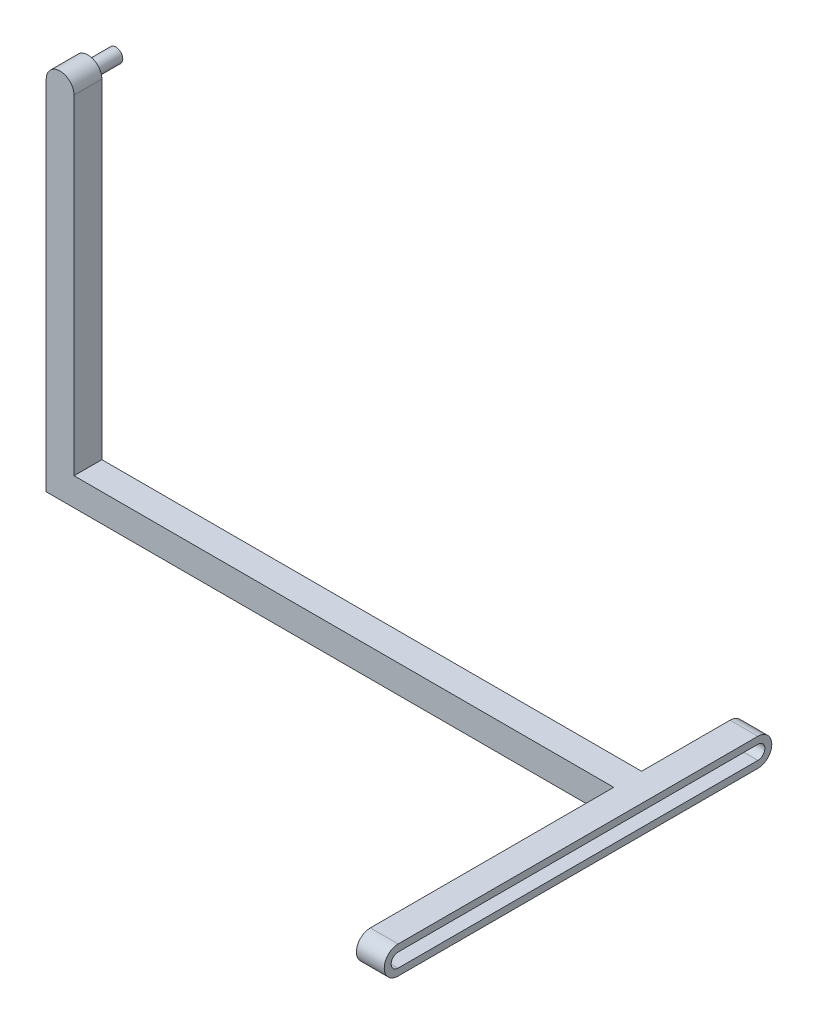
ISO-10303-21;
HEADER;
FILE_DESCRIPTION(('STEP AP214'),'2;1');
FILE_NAME('part.step','',(''),(''),'','','');
FILE_SCHEMA(('AUTOMOTIVE_DESIGN { 1 0 10303 214 1 1 1 1 }'));
ENDSEC;
DATA;
#1=APPLICATION_CONTEXT('core data for automotive mechanical design processes');
#2=APPLICATION_PROTOCOL_DEFINITION('international standard','automotive_design',2000,#1);
#3=PRODUCT_CONTEXT('',#1,'mechanical');
#4=PRODUCT('Part','Part','',(#3));
#5=PRODUCT_RELATED_PRODUCT_CATEGORY('part','',(#4));
#6=PRODUCT_DEFINITION_FORMATION('','',#4);
#7=PRODUCT_DEFINITION_CONTEXT('part definition',#1,'design');
#8=PRODUCT_DEFINITION('design','',#6,#7);
#9=PRODUCT_DEFINITION_SHAPE('','',#8);
#10=(LENGTH_UNIT() NAMED_UNIT(*) SI_UNIT(.MILLI.,.METRE.));
#11=(NAMED_UNIT(*) PLANE_ANGLE_UNIT() SI_UNIT($,.RADIAN.));
#12=(NAMED_UNIT(*) SI_UNIT($,.STERADIAN.) SOLID_ANGLE_UNIT());
#13=UNCERTAINTY_MEASURE_WITH_UNIT(LENGTH_MEASURE(1.E-05),#10,'distance_accuracy_value','');
#14=(GEOMETRIC_REPRESENTATION_CONTEXT(3) GLOBAL_UNCERTAINTY_ASSIGNED_CONTEXT((#13)) GLOBAL_UNIT_ASSIGNED_CONTEXT((#10,
#11,#12)) REPRESENTATION_CONTEXT('',''));
#15=CARTESIAN_POINT('',(0.,0.,0.));
#16=DIRECTION('',(0.,0.,1.));
#17=DIRECTION('',(1.,0.,0.));
#18=AXIS2_PLACEMENT_3D('',#15,#16,#17);
#19=CARTESIAN_POINT('',(0.,0.,-199.));
#20=DIRECTION('',(0.,0.,1.));
#21=DIRECTION('',(1.,0.,0.));
#22=AXIS2_PLACEMENT_3D('',#19,#20,#21);
#23=PLANE('',#22);
#24=DIRECTION('',(0.,1.,0.));
#25=VECTOR('',#24,1.);
#26=CARTESIAN_POINT('',(-20.,0.,-199.));
#27=LINE('',#26,#25);
#28=CARTESIAN_POINT('',(-20.,-193.443240014958,-199.));
#29=VERTEX_POINT('',#28);
#30=CARTESIAN_POINT('',(-20.,-191.443240014958,-199.));
#31=VERTEX_POINT('',#30);
#32=EDGE_CURVE('E161',#29,#31,#27,.T.);
#33=ORIENTED_EDGE('',*,*,#32,.T.);
#34=DIRECTION('',(0.,1.,0.));
#35=VECTOR('',#34,1.);
#36=CARTESIAN_POINT('',(-20.,0.,-199.));
#37=LINE('',#36,#35);
#38=CARTESIAN_POINT('',(-20.,-187.443240014958,-199.));
#39=VERTEX_POINT('',#38);
#40=EDGE_CURVE('E152',#31,#39,#37,.T.);
#41=ORIENTED_EDGE('',*,*,#40,.T.);
#42=CARTESIAN_POINT('',(-20.,-185.443240014958,-199.));
#43=VERTEX_POINT('',#42);
#44=EDGE_CURVE('E52',#39,#43,#27,.T.);
#45=ORIENTED_EDGE('',*,*,#44,.T.);
#46=DIRECTION('',(1.,0.,0.));
#47=VECTOR('',#46,1.);
#48=CARTESIAN_POINT('',(0.,-185.443240014958,-199.));
#49=LINE('',#48,#47);
#50=CARTESIAN_POINT('',(-175.088311754569,-185.443240014958,-199.));
#51=VERTEX_POINT('',#50);
#52=EDGE_CURVE('E249',#51,#43,#49,.T.);
#53=ORIENTED_EDGE('',*,*,#52,.F.);
#54=DIRECTION('',(0.,-1.,0.));
#55=VECTOR('',#54,1.);
#56=CARTESIAN_POINT('',(-175.088311754569,0.,-199.));
#57=LINE('',#56,#55);
#58=CARTESIAN_POINT('',(-175.088311754569,-90.7316967124509,-199.));
#59=VERTEX_POINT('',#58);
#60=EDGE_CURVE('E239',#59,#51,#57,.T.);
#61=ORIENTED_EDGE('',*,*,#60,.F.);
#62=CARTESIAN_POINT('',(-179.088311754569,-90.7316967124509,-199.));
#63=DIRECTION('',(0.,0.,1.));
#64=DIRECTION('',(1.,0.,0.));
#65=AXIS2_PLACEMENT_3D('',#62,#63,#64);
#66=CIRCLE('',#65,4.);
#67=CARTESIAN_POINT('',(-183.088311754569,-90.7316967124509,-199.));
#68=VERTEX_POINT('',#67);
#69=EDGE_CURVE('E242',#68,#59,#66,.F.);
#70=ORIENTED_EDGE('',*,*,#69,.F.);
#71=DIRECTION('',(0.,-1.,0.));
#72=VECTOR('',#71,1.);
#73=CARTESIAN_POINT('',(-183.088311754569,0.,-199.));
#74=LINE('',#73,#72);
#75=CARTESIAN_POINT('',(-183.088311754569,-193.443240014958,-199.));
#76=VERTEX_POINT('',#75);
#77=EDGE_CURVE('E246',#68,#76,#74,.T.);
#78=ORIENTED_EDGE('',*,*,#77,.T.);
#79=DIRECTION('',(1.,0.,0.));
#80=VECTOR('',#79,1.);
#81=CARTESIAN_POINT('',(0.,-193.443240014958,-199.));
#82=LINE('',#81,#80);
#83=EDGE_CURVE('E59',#76,#29,#82,.T.);
#84=ORIENTED_EDGE('',*,*,#83,.T.);
#85=EDGE_LOOP('',(#33,#41,#45,#53,#61,#70,#78,#84));
#86=FACE_BOUND('',#85,.T.);
#87=ADVANCED_FACE('F37',(#86),#23,.T.);
#88=CARTESIAN_POINT('',(0.,0.,-207.));
#89=DIRECTION('',(0.,0.,1.));
#90=DIRECTION('',(1.,0.,0.));
#91=AXIS2_PLACEMENT_3D('',#88,#89,#90);
#92=PLANE('',#91);
#93=CARTESIAN_POINT('',(-179.088311754569,-90.7316967124509,-207.));
#94=DIRECTION('',(0.,0.,1.));
#95=DIRECTION('',(1.,0.,0.));
#96=AXIS2_PLACEMENT_3D('',#93,#94,#95);
#97=CIRCLE('',#96,2.);
#98=CARTESIAN_POINT('',(-177.088311754569,-90.7316967124509,-207.));
#99=VERTEX_POINT('',#98);
#100=EDGE_CURVE('E275',#99,#99,#97,.F.);
#101=ORIENTED_EDGE('',*,*,#100,.F.);
#102=EDGE_LOOP('',(#101));
#103=FACE_BOUND('',#102,.T.);
#104=DIRECTION('',(0.,1.,0.));
#105=VECTOR('',#104,1.);
#106=CARTESIAN_POINT('',(-20.,0.,-207.));
#107=LINE('',#106,#105);
#108=CARTESIAN_POINT('',(-20.,-191.443240014958,-207.));
#109=VERTEX_POINT('',#108);
#110=CARTESIAN_POINT('',(-20.,-187.443240014958,-207.));
#111=VERTEX_POINT('',#110);
#112=EDGE_CURVE('E155',#109,#111,#107,.T.);
#113=ORIENTED_EDGE('',*,*,#112,.F.);
#114=DIRECTION('',(0.,1.,0.));
#115=VECTOR('',#114,1.);
#116=CARTESIAN_POINT('',(-20.,0.,-207.));
#117=LINE('',#116,#115);
#118=CARTESIAN_POINT('',(-20.,-193.443240014958,-207.));
#119=VERTEX_POINT('',#118);
#120=EDGE_CURVE('E41',#119,#109,#117,.T.);
#121=ORIENTED_EDGE('',*,*,#120,.F.);
#122=DIRECTION('',(1.,0.,0.));
#123=VECTOR('',#122,1.);
#124=CARTESIAN_POINT('',(0.,-193.443240014958,-207.));
#125=LINE('',#124,#123);
#126=CARTESIAN_POINT('',(-183.088311754569,-193.443240014958,-207.));
#127=VERTEX_POINT('',#126);
#128=EDGE_CURVE('E259',#127,#119,#125,.T.);
#129=ORIENTED_EDGE('',*,*,#128,.F.);
#130=DIRECTION('',(0.,-1.,0.));
#131=VECTOR('',#130,1.);
#132=CARTESIAN_POINT('',(-183.088311754569,0.,-207.));
#133=LINE('',#132,#131);
#134=CARTESIAN_POINT('',(-183.088311754569,-90.7316967124509,-207.));
#135=VERTEX_POINT('',#134);
#136=EDGE_CURVE('E257',#135,#127,#133,.T.);
#137=ORIENTED_EDGE('',*,*,#136,.F.);
#138=CARTESIAN_POINT('',(-179.088311754569,-90.7316967124509,-207.));
#139=DIRECTION('',(0.,0.,1.));
#140=DIRECTION('',(1.,0.,0.));
#141=AXIS2_PLACEMENT_3D('',#138,#139,#140);
#142=CIRCLE('',#141,4.);
#143=CARTESIAN_POINT('',(-175.088311754569,-90.7316967124509,-207.));
#144=VERTEX_POINT('',#143);
#145=EDGE_CURVE('E254',#135,#144,#142,.F.);
#146=ORIENTED_EDGE('',*,*,#145,.T.);
#147=DIRECTION('',(0.,-1.,0.));
#148=VECTOR('',#147,1.);
#149=CARTESIAN_POINT('',(-175.088311754569,0.,-207.));
#150=LINE('',#149,#148);
#151=CARTESIAN_POINT('',(-175.088311754569,-185.443240014958,-207.));
#152=VERTEX_POINT('',#151);
#153=EDGE_CURVE('E238',#144,#152,#150,.T.);
#154=ORIENTED_EDGE('',*,*,#153,.T.);
#155=DIRECTION('',(1.,0.,0.));
#156=VECTOR('',#155,1.);
#157=CARTESIAN_POINT('',(0.,-185.443240014958,-207.));
#158=LINE('',#157,#156);
#159=CARTESIAN_POINT('',(-20.,-185.443240014958,-207.));
#160=VERTEX_POINT('',#159);
#161=EDGE_CURVE('E243',#152,#160,#158,.T.);
#162=ORIENTED_EDGE('',*,*,#161,.T.);
#163=EDGE_CURVE('E11',#111,#160,#117,.T.);
#164=ORIENTED_EDGE('',*,*,#163,.F.);
#165=EDGE_LOOP('',(#113,#121,#129,#137,#146,#154,#162,#164));
#166=FACE_BOUND('',#165,.T.);
#167=ADVANCED_FACE('F288',(#103,#166),#92,.F.);
#168=CARTESIAN_POINT('',(-12.,0.,-199.));
#169=DIRECTION('',(1.,0.,0.));
#170=DIRECTION('',(0.,0.,-1.));
#171=AXIS2_PLACEMENT_3D('',#168,#169,#170);
#172=PLANE('',#171);
#173=DIRECTION('',(0.,0.,-1.));
#174=VECTOR('',#173,1.);
#175=CARTESIAN_POINT('',(-12.,-193.443240014958,-199.));
#176=LINE('',#175,#174);
#177=CARTESIAN_POINT('',(-12.,-193.443240014958,-129.046106882113));
#178=VERTEX_POINT('',#177);
#179=CARTESIAN_POINT('',(-12.,-193.443240014958,-232.412295168564));
#180=VERTEX_POINT('',#179);
#181=EDGE_CURVE('E267',#178,#180,#176,.T.);
#182=ORIENTED_EDGE('',*,*,#181,.T.);
#183=CARTESIAN_POINT('',(-12.,-189.443240014958,-232.412295168564));
#184=DIRECTION('',(-1.,0.,0.));
#185=DIRECTION('',(0.,0.,1.));
#186=AXIS2_PLACEMENT_3D('',#183,#184,#185);
#187=CIRCLE('',#186,4.);
#188=CARTESIAN_POINT('',(-12.,-185.443240014958,-232.412295168564));
#189=VERTEX_POINT('',#188);
#190=EDGE_CURVE('E213',#189,#180,#187,.T.);
#191=ORIENTED_EDGE('',*,*,#190,.F.);
#192=DIRECTION('',(0.,0.,-1.));
#193=VECTOR('',#192,1.);
#194=CARTESIAN_POINT('',(-12.,-185.443240014958,-199.));
#195=LINE('',#194,#193);
#196=CARTESIAN_POINT('',(-12.,-185.443240014958,-129.046106882113));
#197=VERTEX_POINT('',#196);
#198=EDGE_CURVE('E265',#197,#189,#195,.T.);
#199=ORIENTED_EDGE('',*,*,#198,.F.);
#200=CARTESIAN_POINT('',(-12.,-189.443240014958,-129.046106882113));
#201=DIRECTION('',(-1.,0.,0.));
#202=DIRECTION('',(0.,0.,-1.));
#203=AXIS2_PLACEMENT_3D('',#200,#201,#202);
#204=CIRCLE('',#203,4.);
#205=EDGE_CURVE('E209',#178,#197,#204,.T.);
#206=ORIENTED_EDGE('',*,*,#205,.F.);
#207=EDGE_LOOP('',(#182,#191,#199,#206));
#208=FACE_BOUND('',#207,.T.);
#209=CARTESIAN_POINT('',(-12.,-189.443240014958,-129.046106882113));
#210=DIRECTION('',(-1.,0.,0.));
#211=DIRECTION('',(0.,0.,-1.));
#212=AXIS2_PLACEMENT_3D('',#209,#210,#211);
#213=CIRCLE('',#212,2.);
#214=CARTESIAN_POINT('',(-12.,-191.443240014958,-129.046106882113));
#215=VERTEX_POINT('',#214);
#216=CARTESIAN_POINT('',(-12.,-187.443240014958,-129.046106882113));
#217=VERTEX_POINT('',#216);
#218=EDGE_CURVE('E163',#215,#217,#213,.T.);
#219=ORIENTED_EDGE('',*,*,#218,.T.);
#220=DIRECTION('',(0.,0.,-1.));
#221=VECTOR('',#220,1.);
#222=CARTESIAN_POINT('',(-12.,-187.443240014958,-129.046106882113));
#223=LINE('',#222,#221);
#224=CARTESIAN_POINT('',(-12.,-187.443240014958,-232.412295168564));
#225=VERTEX_POINT('',#224);
#226=EDGE_CURVE('E194',#217,#225,#223,.T.);
#227=ORIENTED_EDGE('',*,*,#226,.T.);
#228=CARTESIAN_POINT('',(-12.,-189.443240014958,-232.412295168564));
#229=DIRECTION('',(-1.,0.,0.));
#230=DIRECTION('',(0.,0.,1.));
#231=AXIS2_PLACEMENT_3D('',#228,#229,#230);
#232=CIRCLE('',#231,2.);
#233=CARTESIAN_POINT('',(-12.,-191.443240014958,-232.412295168564));
#234=VERTEX_POINT('',#233);
#235=EDGE_CURVE('E196',#225,#234,#232,.T.);
#236=ORIENTED_EDGE('',*,*,#235,.T.);
#237=DIRECTION('',(0.,0.,1.));
#238=VECTOR('',#237,1.);
#239=CARTESIAN_POINT('',(-12.,-191.443240014958,-129.046106882113));
#240=LINE('',#239,#238);
#241=EDGE_CURVE('E199',#234,#215,#240,.T.);
#242=ORIENTED_EDGE('',*,*,#241,.T.);
#243=EDGE_LOOP('',(#219,#227,#236,#242));
#244=FACE_BOUND('',#243,.T.);
#245=ADVANCED_FACE('F318',(#208,#244),#172,.T.);
#246=CARTESIAN_POINT('',(-175.088311754569,0.,-199.));
#247=DIRECTION('',(1.,0.,0.));
#248=DIRECTION('',(0.,0.,-1.));
#249=AXIS2_PLACEMENT_3D('',#246,#247,#248);
#250=PLANE('',#249);
#251=ORIENTED_EDGE('',*,*,#153,.F.);
#252=DIRECTION('',(0.,0.,-1.));
#253=VECTOR('',#252,1.);
#254=CARTESIAN_POINT('',(-175.088311754569,-90.7316967124509,-199.));
#255=LINE('',#254,#253);
#256=EDGE_CURVE('E274',#59,#144,#255,.T.);
#257=ORIENTED_EDGE('',*,*,#256,.F.);
#258=ORIENTED_EDGE('',*,*,#60,.T.);
#259=DIRECTION('',(0.,0.,-1.));
#260=VECTOR('',#259,1.);
#261=CARTESIAN_POINT('',(-175.088311754569,-185.443240014958,-199.));
#262=LINE('',#261,#260);
#263=EDGE_CURVE('E251',#51,#152,#262,.T.);
#264=ORIENTED_EDGE('',*,*,#263,.T.);
#265=EDGE_LOOP('',(#251,#257,#258,#264));
#266=FACE_BOUND('',#265,.T.);
#267=ADVANCED_FACE('F39',(#266),#250,.T.);
#268=CARTESIAN_POINT('',(-179.088311754569,-90.7316967124509,-199.));
#269=DIRECTION('',(0.,0.,-1.));
#270=DIRECTION('',(-1.,0.,0.));
#271=AXIS2_PLACEMENT_3D('',#268,#269,#270);
#272=CYLINDRICAL_SURFACE('',#271,4.);
#273=ORIENTED_EDGE('',*,*,#145,.F.);
#274=DIRECTION('',(0.,0.,-1.));
#275=VECTOR('',#274,1.);
#276=CARTESIAN_POINT('',(-183.088311754569,-90.7316967124509,-199.));
#277=LINE('',#276,#275);
#278=EDGE_CURVE('E272',#68,#135,#277,.T.);
#279=ORIENTED_EDGE('',*,*,#278,.F.);
#280=ORIENTED_EDGE('',*,*,#69,.T.);
#281=ORIENTED_EDGE('',*,*,#256,.T.);
#282=EDGE_LOOP('',(#273,#279,#280,#281));
#283=FACE_BOUND('',#282,.T.);
#284=ADVANCED_FACE('F301',(#283),#272,.T.);
#285=CARTESIAN_POINT('',(-183.088311754569,0.,-199.));
#286=DIRECTION('',(1.,0.,0.));
#287=DIRECTION('',(0.,0.,-1.));
#288=AXIS2_PLACEMENT_3D('',#285,#286,#287);
#289=PLANE('',#288);
#290=ORIENTED_EDGE('',*,*,#136,.T.);
#291=DIRECTION('',(0.,0.,-1.));
#292=VECTOR('',#291,1.);
#293=CARTESIAN_POINT('',(-183.088311754569,-193.443240014958,-199.));
#294=LINE('',#293,#292);
#295=EDGE_CURVE('E269',#76,#127,#294,.T.);
#296=ORIENTED_EDGE('',*,*,#295,.F.);
#297=ORIENTED_EDGE('',*,*,#77,.F.);
#298=ORIENTED_EDGE('',*,*,#278,.T.);
#299=EDGE_LOOP('',(#290,#296,#297,#298));
#300=FACE_BOUND('',#299,.T.);
#301=ADVANCED_FACE('F297',(#300),#289,.F.);
#302=CARTESIAN_POINT('',(0.,-193.443240014958,-199.));
#303=DIRECTION('',(0.,1.,0.));
#304=DIRECTION('',(0.,0.,1.));
#305=AXIS2_PLACEMENT_3D('',#302,#303,#304);
#306=PLANE('',#305);
#307=ORIENTED_EDGE('',*,*,#181,.F.);
#308=DIRECTION('',(1.,0.,0.));
#309=VECTOR('',#308,1.);
#310=CARTESIAN_POINT('',(-20.,-193.443240014958,-129.046106882113));
#311=LINE('',#310,#309);
#312=CARTESIAN_POINT('',(-20.,-193.443240014958,-129.046106882113));
#313=VERTEX_POINT('',#312);
#314=EDGE_CURVE('E220',#313,#178,#311,.T.);
#315=ORIENTED_EDGE('',*,*,#314,.F.);
#316=DIRECTION('',(0.,0.,1.));
#317=VECTOR('',#316,1.);
#318=CARTESIAN_POINT('',(-20.,-193.443240014958,-129.046106882113));
#319=LINE('',#318,#317);
#320=EDGE_CURVE('E217',#29,#313,#319,.T.);
#321=ORIENTED_EDGE('',*,*,#320,.F.);
#322=ORIENTED_EDGE('',*,*,#83,.F.);
#323=ORIENTED_EDGE('',*,*,#295,.T.);
#324=ORIENTED_EDGE('',*,*,#128,.T.);
#325=CARTESIAN_POINT('',(-20.,-193.443240014958,-232.412295168564));
#326=VERTEX_POINT('',#325);
#327=EDGE_CURVE('E218',#326,#119,#319,.T.);
#328=ORIENTED_EDGE('',*,*,#327,.F.);
#329=DIRECTION('',(1.,0.,0.));
#330=VECTOR('',#329,1.);
#331=CARTESIAN_POINT('',(-20.,-193.443240014958,-232.412295168564));
#332=LINE('',#331,#330);
#333=EDGE_CURVE('E227',#326,#180,#332,.T.);
#334=ORIENTED_EDGE('',*,*,#333,.T.);
#335=EDGE_LOOP('',(#307,#315,#321,#322,#323,#324,#328,#334));
#336=FACE_BOUND('',#335,.T.);
#337=ADVANCED_FACE('F292',(#336),#306,.F.);
#338=CARTESIAN_POINT('',(0.,-185.443240014958,-199.));
#339=DIRECTION('',(0.,1.,0.));
#340=DIRECTION('',(0.,0.,1.));
#341=AXIS2_PLACEMENT_3D('',#338,#339,#340);
#342=PLANE('',#341);
#343=DIRECTION('',(0.,0.,-1.));
#344=VECTOR('',#343,1.);
#345=CARTESIAN_POINT('',(-20.,-185.443240014958,-129.046106882113));
#346=LINE('',#345,#344);
#347=CARTESIAN_POINT('',(-20.,-185.443240014958,-232.412295168564));
#348=VERTEX_POINT('',#347);
#349=EDGE_CURVE('E212',#160,#348,#346,.T.);
#350=ORIENTED_EDGE('',*,*,#349,.F.);
#351=ORIENTED_EDGE('',*,*,#161,.F.);
#352=ORIENTED_EDGE('',*,*,#263,.F.);
#353=ORIENTED_EDGE('',*,*,#52,.T.);
#354=CARTESIAN_POINT('',(-20.,-185.443240014958,-129.046106882113));
#355=VERTEX_POINT('',#354);
#356=EDGE_CURVE('E172',#355,#43,#346,.T.);
#357=ORIENTED_EDGE('',*,*,#356,.F.);
#358=DIRECTION('',(1.,0.,0.));
#359=VECTOR('',#358,1.);
#360=CARTESIAN_POINT('',(-20.,-185.443240014958,-129.046106882113));
#361=LINE('',#360,#359);
#362=EDGE_CURVE('E173',#355,#197,#361,.T.);
#363=ORIENTED_EDGE('',*,*,#362,.T.);
#364=ORIENTED_EDGE('',*,*,#198,.T.);
#365=DIRECTION('',(1.,0.,0.));
#366=VECTOR('',#365,1.);
#367=CARTESIAN_POINT('',(-20.,-185.443240014958,-232.412295168564));
#368=LINE('',#367,#366);
#369=EDGE_CURVE('E230',#348,#189,#368,.T.);
#370=ORIENTED_EDGE('',*,*,#369,.F.);
#371=EDGE_LOOP('',(#350,#351,#352,#353,#357,#363,#364,#370));
#372=FACE_BOUND('',#371,.T.);
#373=ADVANCED_FACE('F308',(#372),#342,.T.);
#374=CARTESIAN_POINT('',(-179.088311754569,-90.7316967124509,-215.));
#375=DIRECTION('',(0.,0.,1.));
#376=DIRECTION('',(1.,0.,0.));
#377=AXIS2_PLACEMENT_3D('',#374,#375,#376);
#378=CYLINDRICAL_SURFACE('',#377,2.);
#379=CARTESIAN_POINT('',(-179.088311754569,-90.7316967124509,-215.));
#380=DIRECTION('',(0.,0.,1.));
#381=DIRECTION('',(1.,0.,0.));
#382=AXIS2_PLACEMENT_3D('',#379,#380,#381);
#383=CIRCLE('',#382,2.);
#384=CARTESIAN_POINT('',(-177.088311754569,-90.7316967124509,-215.));
#385=VERTEX_POINT('',#384);
#386=EDGE_CURVE('E235',#385,#385,#383,.F.);
#387=ORIENTED_EDGE('',*,*,#386,.F.);
#388=EDGE_LOOP('',(#387));
#389=FACE_BOUND('',#388,.T.);
#390=ORIENTED_EDGE('',*,*,#100,.T.);
#391=EDGE_LOOP('',(#390));
#392=FACE_BOUND('',#391,.T.);
#393=ADVANCED_FACE('F345',(#389,#392),#378,.T.);
#394=CARTESIAN_POINT('',(0.,0.,-215.));
#395=DIRECTION('',(0.,0.,1.));
#396=DIRECTION('',(1.,0.,0.));
#397=AXIS2_PLACEMENT_3D('',#394,#395,#396);
#398=PLANE('',#397);
#399=ORIENTED_EDGE('',*,*,#386,.T.);
#400=EDGE_LOOP('',(#399));
#401=FACE_BOUND('',#400,.T.);
#402=ADVANCED_FACE('F422',(#401),#398,.F.);
#403=CARTESIAN_POINT('',(-20.,-189.443240014958,-232.412295168564));
#404=DIRECTION('',(1.,0.,0.));
#405=DIRECTION('',(0.,0.,-1.));
#406=AXIS2_PLACEMENT_3D('',#403,#404,#405);
#407=CYLINDRICAL_SURFACE('',#406,4.);
#408=ORIENTED_EDGE('',*,*,#190,.T.);
#409=ORIENTED_EDGE('',*,*,#333,.F.);
#410=CARTESIAN_POINT('',(-20.,-189.443240014958,-232.412295168564));
#411=DIRECTION('',(-1.,0.,0.));
#412=DIRECTION('',(0.,0.,1.));
#413=AXIS2_PLACEMENT_3D('',#410,#411,#412);
#414=CIRCLE('',#413,4.);
#415=EDGE_CURVE('E215',#348,#326,#414,.T.);
#416=ORIENTED_EDGE('',*,*,#415,.F.);
#417=ORIENTED_EDGE('',*,*,#369,.T.);
#418=EDGE_LOOP('',(#408,#409,#416,#417));
#419=FACE_BOUND('',#418,.T.);
#420=ADVANCED_FACE('F334',(#419),#407,.T.);
#421=CARTESIAN_POINT('',(-20.,-189.443240014958,-232.412295168564));
#422=DIRECTION('',(1.,0.,0.));
#423=DIRECTION('',(0.,0.,-1.));
#424=AXIS2_PLACEMENT_3D('',#421,#422,#423);
#425=CYLINDRICAL_SURFACE('',#424,2.);
#426=ORIENTED_EDGE('',*,*,#235,.F.);
#427=DIRECTION('',(1.,0.,0.));
#428=VECTOR('',#427,1.);
#429=CARTESIAN_POINT('',(-20.,-187.443240014958,-232.412295168564));
#430=LINE('',#429,#428);
#431=CARTESIAN_POINT('',(-20.,-187.443240014958,-232.412295168564));
#432=VERTEX_POINT('',#431);
#433=EDGE_CURVE('E205',#432,#225,#430,.T.);
#434=ORIENTED_EDGE('',*,*,#433,.F.);
#435=CARTESIAN_POINT('',(-20.,-189.443240014958,-232.412295168564));
#436=DIRECTION('',(-1.,0.,0.));
#437=DIRECTION('',(0.,0.,1.));
#438=AXIS2_PLACEMENT_3D('',#435,#436,#437);
#439=CIRCLE('',#438,2.);
#440=CARTESIAN_POINT('',(-20.,-191.443240014958,-232.412295168564));
#441=VERTEX_POINT('',#440);
#442=EDGE_CURVE('E179',#432,#441,#439,.T.);
#443=ORIENTED_EDGE('',*,*,#442,.T.);
#444=DIRECTION('',(1.,0.,0.));
#445=VECTOR('',#444,1.);
#446=CARTESIAN_POINT('',(-20.,-191.443240014958,-232.412295168564));
#447=LINE('',#446,#445);
#448=EDGE_CURVE('E203',#441,#234,#447,.T.);
#449=ORIENTED_EDGE('',*,*,#448,.T.);
#450=EDGE_LOOP('',(#426,#434,#443,#449));
#451=FACE_BOUND('',#450,.T.);
#452=ADVANCED_FACE('F315',(#451),#425,.F.);
#453=CARTESIAN_POINT('',(-20.,-191.443240014958,-129.046106882113));
#454=DIRECTION('',(0.,1.,0.));
#455=DIRECTION('',(0.,0.,1.));
#456=AXIS2_PLACEMENT_3D('',#453,#454,#455);
#457=PLANE('',#456);
#458=DIRECTION('',(0.,0.,1.));
#459=VECTOR('',#458,1.);
#460=CARTESIAN_POINT('',(-20.,-191.443240014958,-129.046106882113));
#461=LINE('',#460,#459);
#462=EDGE_CURVE('E188',#441,#109,#461,.T.);
#463=ORIENTED_EDGE('',*,*,#462,.T.);
#464=DIRECTION('',(0.,0.,-1.));
#465=VECTOR('',#464,1.);
#466=CARTESIAN_POINT('',(-20.,-191.443240014958,-129.046106882113));
#467=LINE('',#466,#465);
#468=EDGE_CURVE('E159',#31,#109,#467,.T.);
#469=ORIENTED_EDGE('',*,*,#468,.F.);
#470=CARTESIAN_POINT('',(-20.,-191.443240014958,-129.046106882113));
#471=VERTEX_POINT('',#470);
#472=EDGE_CURVE('E183',#31,#471,#461,.T.);
#473=ORIENTED_EDGE('',*,*,#472,.T.);
#474=DIRECTION('',(1.,0.,0.));
#475=VECTOR('',#474,1.);
#476=CARTESIAN_POINT('',(-20.,-191.443240014958,-129.046106882113));
#477=LINE('',#476,#475);
#478=EDGE_CURVE('E191',#471,#215,#477,.T.);
#479=ORIENTED_EDGE('',*,*,#478,.T.);
#480=ORIENTED_EDGE('',*,*,#241,.F.);
#481=ORIENTED_EDGE('',*,*,#448,.F.);
#482=EDGE_LOOP('',(#463,#469,#473,#479,#480,#481));
#483=FACE_BOUND('',#482,.T.);
#484=ADVANCED_FACE('F324',(#483),#457,.T.);
#485=CARTESIAN_POINT('',(-20.,-187.443240014958,-129.046106882113));
#486=DIRECTION('',(0.,-1.,0.));
#487=DIRECTION('',(0.,0.,-1.));
#488=AXIS2_PLACEMENT_3D('',#485,#486,#487);
#489=PLANE('',#488);
#490=ORIENTED_EDGE('',*,*,#226,.F.);
#491=DIRECTION('',(1.,0.,0.));
#492=VECTOR('',#491,1.);
#493=CARTESIAN_POINT('',(-20.,-187.443240014958,-129.046106882113));
#494=LINE('',#493,#492);
#495=CARTESIAN_POINT('',(-20.,-187.443240014958,-129.046106882113));
#496=VERTEX_POINT('',#495);
#497=EDGE_CURVE('E178',#496,#217,#494,.T.);
#498=ORIENTED_EDGE('',*,*,#497,.F.);
#499=DIRECTION('',(0.,0.,-1.));
#500=VECTOR('',#499,1.);
#501=CARTESIAN_POINT('',(-20.,-187.443240014958,-129.046106882113));
#502=LINE('',#501,#500);
#503=EDGE_CURVE('E170',#496,#39,#502,.T.);
#504=ORIENTED_EDGE('',*,*,#503,.T.);
#505=DIRECTION('',(0.,0.,-1.));
#506=VECTOR('',#505,1.);
#507=CARTESIAN_POINT('',(-20.,-187.443240014958,-129.046106882113));
#508=LINE('',#507,#506);
#509=EDGE_CURVE('E150',#39,#111,#508,.T.);
#510=ORIENTED_EDGE('',*,*,#509,.T.);
#511=EDGE_CURVE('E180',#111,#432,#502,.T.);
#512=ORIENTED_EDGE('',*,*,#511,.T.);
#513=ORIENTED_EDGE('',*,*,#433,.T.);
#514=EDGE_LOOP('',(#490,#498,#504,#510,#512,#513));
#515=FACE_BOUND('',#514,.T.);
#516=ADVANCED_FACE('F176',(#515),#489,.T.);
#517=CARTESIAN_POINT('',(-20.,-189.443240014958,-129.046106882113));
#518=DIRECTION('',(1.,0.,0.));
#519=DIRECTION('',(0.,0.,-1.));
#520=AXIS2_PLACEMENT_3D('',#517,#518,#519);
#521=PLANE('',#520);
#522=ORIENTED_EDGE('',*,*,#327,.T.);
#523=ORIENTED_EDGE('',*,*,#120,.T.);
#524=ORIENTED_EDGE('',*,*,#462,.F.);
#525=ORIENTED_EDGE('',*,*,#442,.F.);
#526=ORIENTED_EDGE('',*,*,#511,.F.);
#527=ORIENTED_EDGE('',*,*,#163,.T.);
#528=ORIENTED_EDGE('',*,*,#349,.T.);
#529=ORIENTED_EDGE('',*,*,#415,.T.);
#530=EDGE_LOOP('',(#522,#523,#524,#525,#526,#527,#528,#529));
#531=FACE_BOUND('',#530,.T.);
#532=ADVANCED_FACE('F283',(#531),#521,.F.);
#533=ORIENTED_EDGE('',*,*,#32,.F.);
#534=ORIENTED_EDGE('',*,*,#320,.T.);
#535=CARTESIAN_POINT('',(-20.,-189.443240014958,-129.046106882113));
#536=DIRECTION('',(-1.,0.,0.));
#537=DIRECTION('',(0.,0.,-1.));
#538=AXIS2_PLACEMENT_3D('',#535,#536,#537);
#539=CIRCLE('',#538,4.);
#540=EDGE_CURVE('E210',#313,#355,#539,.T.);
#541=ORIENTED_EDGE('',*,*,#540,.T.);
#542=ORIENTED_EDGE('',*,*,#356,.T.);
#543=ORIENTED_EDGE('',*,*,#44,.F.);
#544=ORIENTED_EDGE('',*,*,#503,.F.);
#545=CARTESIAN_POINT('',(-20.,-189.443240014958,-129.046106882113));
#546=DIRECTION('',(-1.,0.,0.));
#547=DIRECTION('',(0.,0.,-1.));
#548=AXIS2_PLACEMENT_3D('',#545,#546,#547);
#549=CIRCLE('',#548,2.);
#550=EDGE_CURVE('E185',#471,#496,#549,.T.);
#551=ORIENTED_EDGE('',*,*,#550,.F.);
#552=ORIENTED_EDGE('',*,*,#472,.F.);
#553=EDGE_LOOP('',(#533,#534,#541,#542,#543,#544,#551,#552));
#554=FACE_BOUND('',#553,.T.);
#555=ADVANCED_FACE('F168',(#554),#521,.F.);
#556=CARTESIAN_POINT('',(-20.,-189.443240014958,-129.046106882113));
#557=DIRECTION('',(1.,0.,0.));
#558=DIRECTION('',(0.,0.,-1.));
#559=AXIS2_PLACEMENT_3D('',#556,#557,#558);
#560=CYLINDRICAL_SURFACE('',#559,4.);
#561=ORIENTED_EDGE('',*,*,#205,.T.);
#562=ORIENTED_EDGE('',*,*,#362,.F.);
#563=ORIENTED_EDGE('',*,*,#540,.F.);
#564=ORIENTED_EDGE('',*,*,#314,.T.);
#565=EDGE_LOOP('',(#561,#562,#563,#564));
#566=FACE_BOUND('',#565,.T.);
#567=ADVANCED_FACE('F408',(#566),#560,.T.);
#568=CARTESIAN_POINT('',(-20.,-189.443240014958,-129.046106882113));
#569=DIRECTION('',(1.,0.,0.));
#570=DIRECTION('',(0.,0.,-1.));
#571=AXIS2_PLACEMENT_3D('',#568,#569,#570);
#572=CYLINDRICAL_SURFACE('',#571,2.);
#573=ORIENTED_EDGE('',*,*,#218,.F.);
#574=ORIENTED_EDGE('',*,*,#478,.F.);
#575=ORIENTED_EDGE('',*,*,#550,.T.);
#576=ORIENTED_EDGE('',*,*,#497,.T.);
#577=EDGE_LOOP('',(#573,#574,#575,#576));
#578=FACE_BOUND('',#577,.T.);
#579=ADVANCED_FACE('F321',(#578),#572,.F.);
#580=CARTESIAN_POINT('',(-20.,-189.443240014958,-129.046106882113));
#581=DIRECTION('',(1.,0.,0.));
#582=DIRECTION('',(0.,0.,-1.));
#583=AXIS2_PLACEMENT_3D('',#580,#581,#582);
#584=PLANE('',#583);
#585=ORIENTED_EDGE('',*,*,#468,.T.);
#586=ORIENTED_EDGE('',*,*,#112,.T.);
#587=ORIENTED_EDGE('',*,*,#509,.F.);
#588=ORIENTED_EDGE('',*,*,#40,.F.);
#589=EDGE_LOOP('',(#585,#586,#587,#588));
#590=FACE_BOUND('',#589,.T.);
#591=ADVANCED_FACE('F151',(#590),#584,.T.);
#592=CLOSED_SHELL('',(#87,#167,#245,#267,#284,#301,#337,#373,#393,#402,#420,#452,#484,#516,#532,
#555,#567,#579,#591));
#593=MANIFOLD_SOLID_BREP('B2',#592);
#594=ADVANCED_BREP_SHAPE_REPRESENTATION('',(#18,#593),#14);
#595=SHAPE_DEFINITION_REPRESENTATION(#9,#594);
ENDSEC;
END-ISO-10303-21;
